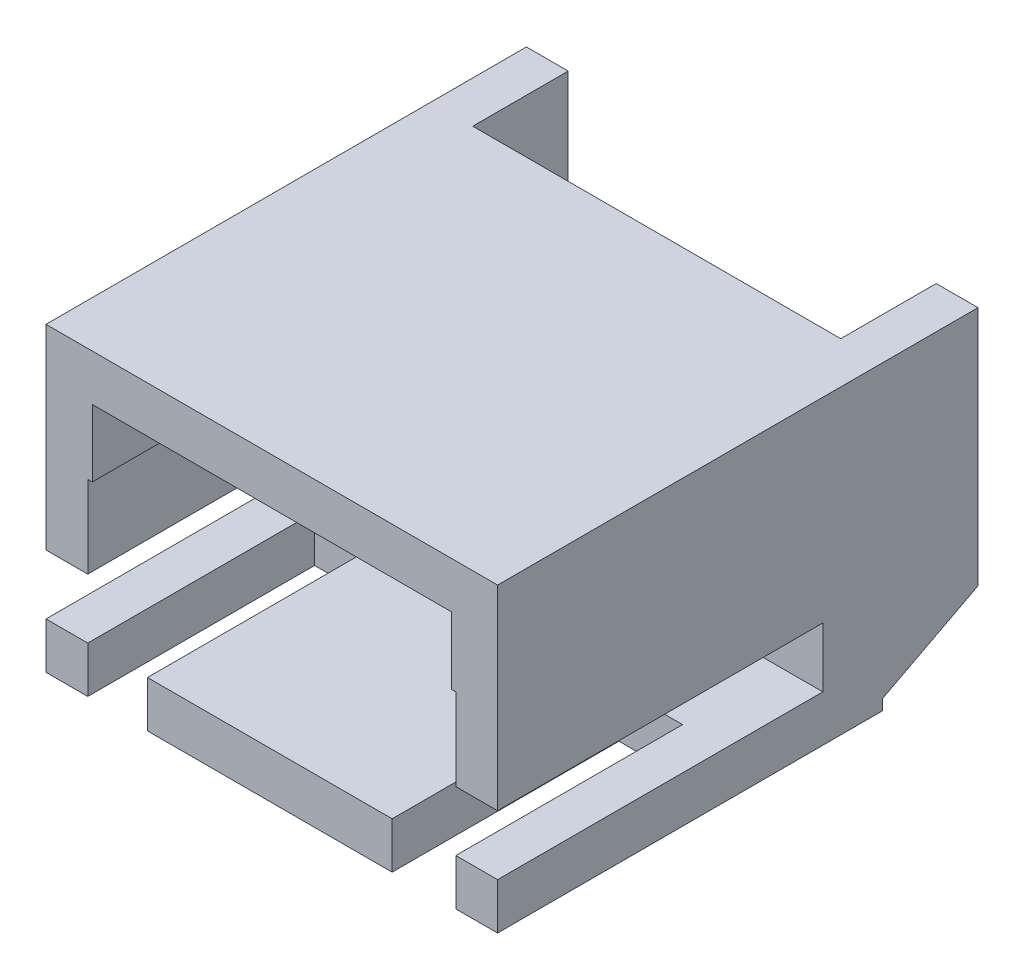
ISO-10303-21;
HEADER;
FILE_DESCRIPTION(('STEP AP214'),'2;1');
FILE_NAME('part.step','',(''),(''),'','','');
FILE_SCHEMA(('AUTOMOTIVE_DESIGN { 1 0 10303 214 1 1 1 1 }'));
ENDSEC;
DATA;
#1=APPLICATION_CONTEXT('core data for automotive mechanical design processes');
#2=APPLICATION_PROTOCOL_DEFINITION('international standard','automotive_design',2000,#1);
#3=PRODUCT_CONTEXT('',#1,'mechanical');
#4=PRODUCT('Part','Part','',(#3));
#5=PRODUCT_RELATED_PRODUCT_CATEGORY('part','',(#4));
#6=PRODUCT_DEFINITION_FORMATION('','',#4);
#7=PRODUCT_DEFINITION_CONTEXT('part definition',#1,'design');
#8=PRODUCT_DEFINITION('design','',#6,#7);
#9=PRODUCT_DEFINITION_SHAPE('','',#8);
#10=(LENGTH_UNIT() NAMED_UNIT(*) SI_UNIT(.MILLI.,.METRE.));
#11=(NAMED_UNIT(*) PLANE_ANGLE_UNIT() SI_UNIT($,.RADIAN.));
#12=(NAMED_UNIT(*) SI_UNIT($,.STERADIAN.) SOLID_ANGLE_UNIT());
#13=UNCERTAINTY_MEASURE_WITH_UNIT(LENGTH_MEASURE(1.E-05),#10,'distance_accuracy_value','');
#14=(GEOMETRIC_REPRESENTATION_CONTEXT(3) GLOBAL_UNCERTAINTY_ASSIGNED_CONTEXT((#13)) GLOBAL_UNIT_ASSIGNED_CONTEXT((#10,
#11,#12)) REPRESENTATION_CONTEXT('',''));
#15=CARTESIAN_POINT('',(0.,0.,0.));
#16=DIRECTION('',(0.,0.,1.));
#17=DIRECTION('',(1.,0.,0.));
#18=AXIS2_PLACEMENT_3D('',#15,#16,#17);
#19=CARTESIAN_POINT('',(37.0934233572,51.94081419327,-1.05));
#20=DIRECTION('',(0.,0.,-1.));
#21=DIRECTION('',(0.,-1.,0.));
#22=AXIS2_PLACEMENT_3D('',#19,#20,#21);
#23=PLANE('',#22);
#24=DIRECTION('',(1.,0.,0.));
#25=VECTOR('',#24,1.);
#26=CARTESIAN_POINT('',(29.127289,54.9,-1.05));
#27=LINE('',#26,#25);
#28=CARTESIAN_POINT('',(29.127289,54.9,-1.04999999999989));
#29=VERTEX_POINT('',#28);
#30=CARTESIAN_POINT('',(29.827289,54.9,-1.05));
#31=VERTEX_POINT('',#30);
#32=EDGE_CURVE('E492',#29,#31,#27,.T.);
#33=ORIENTED_EDGE('',*,*,#32,.T.);
#34=DIRECTION('',(0.,-1.,0.));
#35=VECTOR('',#34,1.);
#36=CARTESIAN_POINT('',(29.827289,54.9,-1.05000000000023));
#37=LINE('',#36,#35);
#38=CARTESIAN_POINT('',(29.827289,50.8633333333333,-1.05));
#39=VERTEX_POINT('',#38);
#40=EDGE_CURVE('E480',#31,#39,#37,.T.);
#41=ORIENTED_EDGE('',*,*,#40,.T.);
#42=DIRECTION('',(1.,0.,0.));
#43=VECTOR('',#42,1.);
#44=CARTESIAN_POINT('',(29.127289,50.8633333333291,-1.05));
#45=LINE('',#44,#43);
#46=CARTESIAN_POINT('',(29.127289,50.8633333333312,-1.05));
#47=VERTEX_POINT('',#46);
#48=EDGE_CURVE('E466',#47,#39,#45,.T.);
#49=ORIENTED_EDGE('',*,*,#48,.F.);
#50=DIRECTION('',(0.,1.,0.));
#51=VECTOR('',#50,1.);
#52=CARTESIAN_POINT('',(29.127289,50.8633333333334,-1.04999999999977));
#53=LINE('',#52,#51);
#54=EDGE_CURVE('E384',#47,#29,#53,.T.);
#55=ORIENTED_EDGE('',*,*,#54,.T.);
#56=EDGE_LOOP('',(#33,#41,#49,#55));
#57=FACE_BOUND('',#56,.T.);
#58=ADVANCED_FACE('F17',(#57),#23,.T.);
#59=CARTESIAN_POINT('',(31.49722712685,53.,4.901261798567));
#60=DIRECTION('',(0.,-1.,0.));
#61=DIRECTION('',(0.,0.,-1.));
#62=AXIS2_PLACEMENT_3D('',#59,#60,#61);
#63=PLANE('',#62);
#64=DIRECTION('',(-1.,0.,0.));
#65=VECTOR('',#64,1.);
#66=CARTESIAN_POINT('',(35.993819,53.,7.));
#67=LINE('',#66,#65);
#68=CARTESIAN_POINT('',(35.993819,53.,7.));
#69=VERTEX_POINT('',#68);
#70=CARTESIAN_POINT('',(35.918819,53.,7.));
#71=VERTEX_POINT('',#70);
#72=EDGE_CURVE('E313',#69,#71,#67,.T.);
#73=ORIENTED_EDGE('',*,*,#72,.T.);
#74=DIRECTION('',(0.,0.,-1.));
#75=VECTOR('',#74,1.);
#76=CARTESIAN_POINT('',(35.918819,53.,7.));
#77=LINE('',#76,#75);
#78=CARTESIAN_POINT('',(35.918819,53.,3.2));
#79=VERTEX_POINT('',#78);
#80=EDGE_CURVE('E564',#71,#79,#77,.T.);
#81=ORIENTED_EDGE('',*,*,#80,.T.);
#82=DIRECTION('',(1.,0.,0.));
#83=VECTOR('',#82,1.);
#84=CARTESIAN_POINT('',(35.918819,53.,3.2));
#85=LINE('',#84,#83);
#86=CARTESIAN_POINT('',(35.993819,53.,3.2));
#87=VERTEX_POINT('',#86);
#88=EDGE_CURVE('E555',#79,#87,#85,.T.);
#89=ORIENTED_EDGE('',*,*,#88,.T.);
#90=DIRECTION('',(0.,0.,1.));
#91=VECTOR('',#90,1.);
#92=CARTESIAN_POINT('',(35.993819,53.,3.2));
#93=LINE('',#92,#91);
#94=EDGE_CURVE('E549',#87,#69,#93,.T.);
#95=ORIENTED_EDGE('',*,*,#94,.T.);
#96=EDGE_LOOP('',(#73,#81,#89,#95));
#97=FACE_BOUND('',#96,.T.);
#98=ADVANCED_FACE('F935',(#97),#63,.T.);
#99=CARTESIAN_POINT('',(-5.,-0.1500000000001,7.));
#100=DIRECTION('',(0.,0.,1.));
#101=DIRECTION('',(1.,0.,0.));
#102=AXIS2_PLACEMENT_3D('',#99,#100,#101);
#103=PLANE('',#102);
#104=DIRECTION('',(0.,-1.,0.));
#105=VECTOR('',#104,1.);
#106=CARTESIAN_POINT('',(29.827289,50.625,7.));
#107=LINE('',#106,#105);
#108=CARTESIAN_POINT('',(29.827289,50.625,7.));
#109=VERTEX_POINT('',#108);
#110=CARTESIAN_POINT('',(29.827289,49.85,7.));
#111=VERTEX_POINT('',#110);
#112=EDGE_CURVE('E11',#109,#111,#107,.T.);
#113=ORIENTED_EDGE('',*,*,#112,.F.);
#114=DIRECTION('',(-1.,0.,0.));
#115=VECTOR('',#114,1.);
#116=CARTESIAN_POINT('',(29.827289,50.625,7.));
#117=LINE('',#116,#115);
#118=CARTESIAN_POINT('',(29.127289,50.625,7.));
#119=VERTEX_POINT('',#118);
#120=EDGE_CURVE('E483',#109,#119,#117,.T.);
#121=ORIENTED_EDGE('',*,*,#120,.T.);
#122=DIRECTION('',(0.,-1.,0.));
#123=VECTOR('',#122,1.);
#124=CARTESIAN_POINT('',(29.127289,50.625,7.));
#125=LINE('',#124,#123);
#126=CARTESIAN_POINT('',(29.127289,49.85,7.));
#127=VERTEX_POINT('',#126);
#128=EDGE_CURVE('E416',#119,#127,#125,.T.);
#129=ORIENTED_EDGE('',*,*,#128,.T.);
#130=DIRECTION('',(-1.,0.,0.));
#131=VECTOR('',#130,1.);
#132=CARTESIAN_POINT('',(29.827289,49.85,7.));
#133=LINE('',#132,#131);
#134=EDGE_CURVE('E426',#111,#127,#133,.T.);
#135=ORIENTED_EDGE('',*,*,#134,.F.);
#136=EDGE_LOOP('',(#113,#121,#129,#135));
#137=FACE_BOUND('',#136,.T.);
#138=ADVANCED_FACE('F940',(#137),#103,.T.);
#139=CARTESIAN_POINT('',(29.827289,49.85,7.));
#140=DIRECTION('',(-1.,0.,0.));
#141=DIRECTION('',(0.,0.,1.));
#142=AXIS2_PLACEMENT_3D('',#139,#140,#141);
#143=PLANE('',#142);
#144=DIRECTION('',(0.,0.,-1.));
#145=VECTOR('',#144,1.);
#146=CARTESIAN_POINT('',(29.827289,50.625,7.));
#147=LINE('',#146,#145);
#148=CARTESIAN_POINT('',(29.827289,50.625,3.2));
#149=VERTEX_POINT('',#148);
#150=EDGE_CURVE('E303',#109,#149,#147,.T.);
#151=ORIENTED_EDGE('',*,*,#150,.F.);
#152=ORIENTED_EDGE('',*,*,#112,.T.);
#153=DIRECTION('',(0.,0.,-1.));
#154=VECTOR('',#153,1.);
#155=CARTESIAN_POINT('',(29.827289,49.85,7.));
#156=LINE('',#155,#154);
#157=CARTESIAN_POINT('',(29.827289,49.85,3.2));
#158=VERTEX_POINT('',#157);
#159=EDGE_CURVE('E422',#111,#158,#156,.T.);
#160=ORIENTED_EDGE('',*,*,#159,.T.);
#161=DIRECTION('',(0.,1.,0.));
#162=VECTOR('',#161,1.);
#163=CARTESIAN_POINT('',(29.827289,49.85,3.2));
#164=LINE('',#163,#162);
#165=EDGE_CURVE('E26',#158,#149,#164,.T.);
#166=ORIENTED_EDGE('',*,*,#165,.T.);
#167=EDGE_LOOP('',(#151,#152,#160,#166));
#168=FACE_BOUND('',#167,.T.);
#169=ADVANCED_FACE('F1023',(#168),#143,.F.);
#170=CARTESIAN_POINT('',(29.827289,49.85,3.2));
#171=DIRECTION('',(0.,0.,-1.));
#172=DIRECTION('',(0.,-1.,0.));
#173=AXIS2_PLACEMENT_3D('',#170,#171,#172);
#174=PLANE('',#173);
#175=DIRECTION('',(1.,0.,0.));
#176=VECTOR('',#175,1.);
#177=CARTESIAN_POINT('',(29.827289,50.625,3.2));
#178=LINE('',#177,#176);
#179=CARTESIAN_POINT('',(30.827289,50.625,3.2));
#180=VERTEX_POINT('',#179);
#181=EDGE_CURVE('E296',#149,#180,#178,.T.);
#182=ORIENTED_EDGE('',*,*,#181,.F.);
#183=ORIENTED_EDGE('',*,*,#165,.F.);
#184=DIRECTION('',(1.,0.,0.));
#185=VECTOR('',#184,1.);
#186=CARTESIAN_POINT('',(29.827289,49.85,3.2));
#187=LINE('',#186,#185);
#188=CARTESIAN_POINT('',(30.827289,49.85,3.2));
#189=VERTEX_POINT('',#188);
#190=EDGE_CURVE('E421',#158,#189,#187,.T.);
#191=ORIENTED_EDGE('',*,*,#190,.T.);
#192=DIRECTION('',(0.,1.,0.));
#193=VECTOR('',#192,1.);
#194=CARTESIAN_POINT('',(30.827289,49.85,3.2));
#195=LINE('',#194,#193);
#196=EDGE_CURVE('E20',#189,#180,#195,.T.);
#197=ORIENTED_EDGE('',*,*,#196,.T.);
#198=EDGE_LOOP('',(#182,#183,#191,#197));
#199=FACE_BOUND('',#198,.T.);
#200=ADVANCED_FACE('F1097',(#199),#174,.F.);
#201=CARTESIAN_POINT('',(30.827289,49.85,3.2));
#202=DIRECTION('',(1.,0.,0.));
#203=DIRECTION('',(0.,1.,0.));
#204=AXIS2_PLACEMENT_3D('',#201,#202,#203);
#205=PLANE('',#204);
#206=DIRECTION('',(0.,0.,-1.));
#207=VECTOR('',#206,1.);
#208=CARTESIAN_POINT('',(30.827289,50.625,7.));
#209=LINE('',#208,#207);
#210=CARTESIAN_POINT('',(30.827289,50.625,7.));
#211=VERTEX_POINT('',#210);
#212=EDGE_CURVE('E274',#211,#180,#209,.T.);
#213=ORIENTED_EDGE('',*,*,#212,.T.);
#214=ORIENTED_EDGE('',*,*,#196,.F.);
#215=DIRECTION('',(0.,0.,-1.));
#216=VECTOR('',#215,1.);
#217=CARTESIAN_POINT('',(30.827289,49.85,7.));
#218=LINE('',#217,#216);
#219=CARTESIAN_POINT('',(30.827289,49.85,7.));
#220=VERTEX_POINT('',#219);
#221=EDGE_CURVE('E277',#220,#189,#218,.T.);
#222=ORIENTED_EDGE('',*,*,#221,.F.);
#223=DIRECTION('',(0.,-1.,0.));
#224=VECTOR('',#223,1.);
#225=CARTESIAN_POINT('',(30.827289,50.625,7.));
#226=LINE('',#225,#224);
#227=EDGE_CURVE('E270',#211,#220,#226,.T.);
#228=ORIENTED_EDGE('',*,*,#227,.F.);
#229=EDGE_LOOP('',(#213,#214,#222,#228));
#230=FACE_BOUND('',#229,.T.);
#231=ADVANCED_FACE('F272',(#230),#205,.F.);
#232=CARTESIAN_POINT('',(0.,-0.1500000000001,7.));
#233=DIRECTION('',(0.,0.,1.));
#234=DIRECTION('',(1.,0.,0.));
#235=AXIS2_PLACEMENT_3D('',#232,#233,#234);
#236=PLANE('',#235);
#237=ORIENTED_EDGE('',*,*,#227,.T.);
#238=DIRECTION('',(1.,0.,0.));
#239=VECTOR('',#238,1.);
#240=CARTESIAN_POINT('',(30.827289,49.85,7.));
#241=LINE('',#240,#239);
#242=CARTESIAN_POINT('',(34.927289,49.85,7.));
#243=VERTEX_POINT('',#242);
#244=EDGE_CURVE('E412',#220,#243,#241,.T.);
#245=ORIENTED_EDGE('',*,*,#244,.T.);
#246=DIRECTION('',(0.,1.,0.));
#247=VECTOR('',#246,1.);
#248=CARTESIAN_POINT('',(34.927289,49.85,7.));
#249=LINE('',#248,#247);
#250=CARTESIAN_POINT('',(34.927289,50.625,7.));
#251=VERTEX_POINT('',#250);
#252=EDGE_CURVE('E282',#243,#251,#249,.T.);
#253=ORIENTED_EDGE('',*,*,#252,.T.);
#254=DIRECTION('',(1.,0.,0.));
#255=VECTOR('',#254,1.);
#256=CARTESIAN_POINT('',(30.827289,50.625,7.));
#257=LINE('',#256,#255);
#258=EDGE_CURVE('E285',#211,#251,#257,.T.);
#259=ORIENTED_EDGE('',*,*,#258,.F.);
#260=EDGE_LOOP('',(#237,#245,#253,#259));
#261=FACE_BOUND('',#260,.T.);
#262=ADVANCED_FACE('F286',(#261),#236,.T.);
#263=CARTESIAN_POINT('',(34.927289,49.85,7.));
#264=DIRECTION('',(-1.,0.,0.));
#265=DIRECTION('',(0.,0.,1.));
#266=AXIS2_PLACEMENT_3D('',#263,#264,#265);
#267=PLANE('',#266);
#268=DIRECTION('',(0.,0.,1.));
#269=VECTOR('',#268,1.);
#270=CARTESIAN_POINT('',(34.927289,50.625,3.2));
#271=LINE('',#270,#269);
#272=CARTESIAN_POINT('',(34.927289,50.625,3.2));
#273=VERTEX_POINT('',#272);
#274=EDGE_CURVE('E291',#273,#251,#271,.T.);
#275=ORIENTED_EDGE('',*,*,#274,.T.);
#276=ORIENTED_EDGE('',*,*,#252,.F.);
#277=DIRECTION('',(0.,0.,1.));
#278=VECTOR('',#277,1.);
#279=CARTESIAN_POINT('',(34.927289,49.85,3.2));
#280=LINE('',#279,#278);
#281=CARTESIAN_POINT('',(34.927289,49.85,3.2));
#282=VERTEX_POINT('',#281);
#283=EDGE_CURVE('E332',#282,#243,#280,.T.);
#284=ORIENTED_EDGE('',*,*,#283,.F.);
#285=DIRECTION('',(0.,-1.,0.));
#286=VECTOR('',#285,1.);
#287=CARTESIAN_POINT('',(34.927289,50.625,3.2));
#288=LINE('',#287,#286);
#289=EDGE_CURVE('E436',#273,#282,#288,.T.);
#290=ORIENTED_EDGE('',*,*,#289,.F.);
#291=EDGE_LOOP('',(#275,#276,#284,#290));
#292=FACE_BOUND('',#291,.T.);
#293=ADVANCED_FACE('F1074',(#292),#267,.F.);
#294=CARTESIAN_POINT('',(32.927289,49.85,3.2));
#295=DIRECTION('',(0.,0.,-1.));
#296=DIRECTION('',(0.,-1.,0.));
#297=AXIS2_PLACEMENT_3D('',#294,#295,#296);
#298=PLANE('',#297);
#299=DIRECTION('',(1.,0.,0.));
#300=VECTOR('',#299,1.);
#301=CARTESIAN_POINT('',(34.927289,50.625,3.2));
#302=LINE('',#301,#300);
#303=CARTESIAN_POINT('',(35.993819,50.625,3.2));
#304=VERTEX_POINT('',#303);
#305=EDGE_CURVE('E449',#273,#304,#302,.T.);
#306=ORIENTED_EDGE('',*,*,#305,.F.);
#307=ORIENTED_EDGE('',*,*,#289,.T.);
#308=DIRECTION('',(1.,0.,0.));
#309=VECTOR('',#308,1.);
#310=CARTESIAN_POINT('',(34.927289,49.85,3.2));
#311=LINE('',#310,#309);
#312=CARTESIAN_POINT('',(35.993819,49.85,3.2));
#313=VERTEX_POINT('',#312);
#314=EDGE_CURVE('E329',#282,#313,#311,.T.);
#315=ORIENTED_EDGE('',*,*,#314,.T.);
#316=DIRECTION('',(0.,1.,0.));
#317=VECTOR('',#316,1.);
#318=CARTESIAN_POINT('',(35.993819,49.85,3.2));
#319=LINE('',#318,#317);
#320=EDGE_CURVE('E52',#313,#304,#319,.T.);
#321=ORIENTED_EDGE('',*,*,#320,.T.);
#322=EDGE_LOOP('',(#306,#307,#315,#321));
#323=FACE_BOUND('',#322,.T.);
#324=ADVANCED_FACE('F1066',(#323),#298,.F.);
#325=CARTESIAN_POINT('',(35.993819,49.85,3.2));
#326=DIRECTION('',(1.,0.,0.));
#327=DIRECTION('',(0.,1.,0.));
#328=AXIS2_PLACEMENT_3D('',#325,#326,#327);
#329=PLANE('',#328);
#330=DIRECTION('',(0.,0.,1.));
#331=VECTOR('',#330,1.);
#332=CARTESIAN_POINT('',(35.993819,50.625,3.2));
#333=LINE('',#332,#331);
#334=CARTESIAN_POINT('',(35.993819,50.625,7.));
#335=VERTEX_POINT('',#334);
#336=EDGE_CURVE('E446',#304,#335,#333,.T.);
#337=ORIENTED_EDGE('',*,*,#336,.F.);
#338=ORIENTED_EDGE('',*,*,#320,.F.);
#339=DIRECTION('',(0.,0.,1.));
#340=VECTOR('',#339,1.);
#341=CARTESIAN_POINT('',(35.993819,49.85,3.2));
#342=LINE('',#341,#340);
#343=CARTESIAN_POINT('',(35.993819,49.85,7.));
#344=VERTEX_POINT('',#343);
#345=EDGE_CURVE('E333',#313,#344,#342,.T.);
#346=ORIENTED_EDGE('',*,*,#345,.T.);
#347=DIRECTION('',(0.,1.,0.));
#348=VECTOR('',#347,1.);
#349=CARTESIAN_POINT('',(35.993819,49.85,7.));
#350=LINE('',#349,#348);
#351=EDGE_CURVE('E39',#344,#335,#350,.T.);
#352=ORIENTED_EDGE('',*,*,#351,.T.);
#353=EDGE_LOOP('',(#337,#338,#346,#352));
#354=FACE_BOUND('',#353,.T.);
#355=ADVANCED_FACE('F1057',(#354),#329,.F.);
#356=CARTESIAN_POINT('',(-7.43347,-0.1500000000001,7.));
#357=DIRECTION('',(0.,0.,1.));
#358=DIRECTION('',(1.,0.,0.));
#359=AXIS2_PLACEMENT_3D('',#356,#357,#358);
#360=PLANE('',#359);
#361=DIRECTION('',(1.,0.,0.));
#362=VECTOR('',#361,1.);
#363=CARTESIAN_POINT('',(35.993819,50.625,7.));
#364=LINE('',#363,#362);
#365=CARTESIAN_POINT('',(36.693819,50.625,7.));
#366=VERTEX_POINT('',#365);
#367=EDGE_CURVE('E442',#335,#366,#364,.T.);
#368=ORIENTED_EDGE('',*,*,#367,.F.);
#369=ORIENTED_EDGE('',*,*,#351,.F.);
#370=DIRECTION('',(1.,0.,0.));
#371=VECTOR('',#370,1.);
#372=CARTESIAN_POINT('',(35.993819,49.85,7.));
#373=LINE('',#372,#371);
#374=CARTESIAN_POINT('',(36.693819,49.85,7.));
#375=VERTEX_POINT('',#374);
#376=EDGE_CURVE('E393',#344,#375,#373,.T.);
#377=ORIENTED_EDGE('',*,*,#376,.T.);
#378=DIRECTION('',(0.,-1.,0.));
#379=VECTOR('',#378,1.);
#380=CARTESIAN_POINT('',(36.693819,50.625,7.));
#381=LINE('',#380,#379);
#382=EDGE_CURVE('E343',#366,#375,#381,.T.);
#383=ORIENTED_EDGE('',*,*,#382,.F.);
#384=EDGE_LOOP('',(#368,#369,#377,#383));
#385=FACE_BOUND('',#384,.T.);
#386=ADVANCED_FACE('F1049',(#385),#360,.T.);
#387=CARTESIAN_POINT('',(34.127289,50.625,7.));
#388=DIRECTION('',(0.,-1.,0.));
#389=DIRECTION('',(0.,0.,-1.));
#390=AXIS2_PLACEMENT_3D('',#387,#388,#389);
#391=PLANE('',#390);
#392=DIRECTION('',(1.,0.,0.));
#393=VECTOR('',#392,1.);
#394=CARTESIAN_POINT('',(29.127289,50.625,1.55));
#395=LINE('',#394,#393);
#396=CARTESIAN_POINT('',(29.127289,50.625,1.55));
#397=VERTEX_POINT('',#396);
#398=CARTESIAN_POINT('',(36.693819,50.625,1.55));
#399=VERTEX_POINT('',#398);
#400=EDGE_CURVE('E348',#397,#399,#395,.T.);
#401=ORIENTED_EDGE('',*,*,#400,.F.);
#402=DIRECTION('',(0.,0.,-1.));
#403=VECTOR('',#402,1.);
#404=CARTESIAN_POINT('',(29.127289,50.625,7.));
#405=LINE('',#404,#403);
#406=EDGE_CURVE('E360',#119,#397,#405,.T.);
#407=ORIENTED_EDGE('',*,*,#406,.F.);
#408=ORIENTED_EDGE('',*,*,#120,.F.);
#409=ORIENTED_EDGE('',*,*,#150,.T.);
#410=ORIENTED_EDGE('',*,*,#181,.T.);
#411=ORIENTED_EDGE('',*,*,#212,.F.);
#412=ORIENTED_EDGE('',*,*,#258,.T.);
#413=ORIENTED_EDGE('',*,*,#274,.F.);
#414=ORIENTED_EDGE('',*,*,#305,.T.);
#415=ORIENTED_EDGE('',*,*,#336,.T.);
#416=ORIENTED_EDGE('',*,*,#367,.T.);
#417=DIRECTION('',(0.,0.,-1.));
#418=VECTOR('',#417,1.);
#419=CARTESIAN_POINT('',(36.693819,50.625,7.));
#420=LINE('',#419,#418);
#421=EDGE_CURVE('E339',#366,#399,#420,.T.);
#422=ORIENTED_EDGE('',*,*,#421,.T.);
#423=EDGE_LOOP('',(#401,#407,#408,#409,#410,#411,#412,#413,#414,#415,#416,#422));
#424=FACE_BOUND('',#423,.T.);
#425=ADVANCED_FACE('F293',(#424),#391,.F.);
#426=CARTESIAN_POINT('',(43.72562618935,51.88145198998,1.55));
#427=DIRECTION('',(0.,0.,1.));
#428=DIRECTION('',(1.,0.,0.));
#429=AXIS2_PLACEMENT_3D('',#426,#427,#428);
#430=PLANE('',#429);
#431=ORIENTED_EDGE('',*,*,#400,.T.);
#432=DIRECTION('',(0.,-1.,0.));
#433=VECTOR('',#432,1.);
#434=CARTESIAN_POINT('',(36.693819,51.625,1.55));
#435=LINE('',#434,#433);
#436=CARTESIAN_POINT('',(36.693819,51.625,1.55));
#437=VERTEX_POINT('',#436);
#438=EDGE_CURVE('E344',#437,#399,#435,.T.);
#439=ORIENTED_EDGE('',*,*,#438,.F.);
#440=DIRECTION('',(-1.,0.,0.));
#441=VECTOR('',#440,1.);
#442=CARTESIAN_POINT('',(36.693819,51.625,1.55));
#443=LINE('',#442,#441);
#444=CARTESIAN_POINT('',(35.918819,51.625,1.55));
#445=VERTEX_POINT('',#444);
#446=EDGE_CURVE('E525',#437,#445,#443,.T.);
#447=ORIENTED_EDGE('',*,*,#446,.T.);
#448=DIRECTION('',(0.,-1.,0.));
#449=VECTOR('',#448,1.);
#450=CARTESIAN_POINT('',(35.918819,54.125,1.55));
#451=LINE('',#450,#449);
#452=CARTESIAN_POINT('',(35.918819,54.125,1.55));
#453=VERTEX_POINT('',#452);
#454=EDGE_CURVE('E397',#453,#445,#451,.T.);
#455=ORIENTED_EDGE('',*,*,#454,.F.);
#456=DIRECTION('',(1.,0.,0.));
#457=VECTOR('',#456,1.);
#458=CARTESIAN_POINT('',(29.902289,54.125,1.55));
#459=LINE('',#458,#457);
#460=CARTESIAN_POINT('',(29.902289,54.125,1.55));
#461=VERTEX_POINT('',#460);
#462=EDGE_CURVE('E484',#461,#453,#459,.T.);
#463=ORIENTED_EDGE('',*,*,#462,.F.);
#464=DIRECTION('',(0.,-1.,0.));
#465=VECTOR('',#464,1.);
#466=CARTESIAN_POINT('',(29.902289,54.125,1.55));
#467=LINE('',#466,#465);
#468=CARTESIAN_POINT('',(29.902289,51.625,1.55));
#469=VERTEX_POINT('',#468);
#470=EDGE_CURVE('E572',#461,#469,#467,.T.);
#471=ORIENTED_EDGE('',*,*,#470,.T.);
#472=DIRECTION('',(-1.,0.,0.));
#473=VECTOR('',#472,1.);
#474=CARTESIAN_POINT('',(29.902289,51.625,1.55));
#475=LINE('',#474,#473);
#476=CARTESIAN_POINT('',(29.127289,51.625,1.55));
#477=VERTEX_POINT('',#476);
#478=EDGE_CURVE('E584',#469,#477,#475,.T.);
#479=ORIENTED_EDGE('',*,*,#478,.T.);
#480=DIRECTION('',(0.,-1.,0.));
#481=VECTOR('',#480,1.);
#482=CARTESIAN_POINT('',(29.127289,51.625,1.55));
#483=LINE('',#482,#481);
#484=EDGE_CURVE('E355',#477,#397,#483,.T.);
#485=ORIENTED_EDGE('',*,*,#484,.T.);
#486=EDGE_LOOP('',(#431,#439,#447,#455,#463,#471,#479,#485));
#487=FACE_BOUND('',#486,.T.);
#488=ADVANCED_FACE('F1032',(#487),#430,.T.);
#489=CARTESIAN_POINT('',(33.93069712685,53.,4.901261798567));
#490=DIRECTION('',(0.,-1.,0.));
#491=DIRECTION('',(0.,0.,-1.));
#492=AXIS2_PLACEMENT_3D('',#489,#490,#491);
#493=PLANE('',#492);
#494=DIRECTION('',(0.,0.,1.));
#495=VECTOR('',#494,1.);
#496=CARTESIAN_POINT('',(29.902289,53.,3.2));
#497=LINE('',#496,#495);
#498=CARTESIAN_POINT('',(29.902289,53.,3.2));
#499=VERTEX_POINT('',#498);
#500=CARTESIAN_POINT('',(29.902289,53.,7.));
#501=VERTEX_POINT('',#500);
#502=EDGE_CURVE('E579',#499,#501,#497,.T.);
#503=ORIENTED_EDGE('',*,*,#502,.T.);
#504=DIRECTION('',(1.,0.,0.));
#505=VECTOR('',#504,1.);
#506=CARTESIAN_POINT('',(29.827289,53.,7.));
#507=LINE('',#506,#505);
#508=CARTESIAN_POINT('',(29.827289,53.,7.));
#509=VERTEX_POINT('',#508);
#510=EDGE_CURVE('E454',#509,#501,#507,.T.);
#511=ORIENTED_EDGE('',*,*,#510,.F.);
#512=DIRECTION('',(0.,0.,1.));
#513=VECTOR('',#512,1.);
#514=CARTESIAN_POINT('',(29.827289,53.,3.2));
#515=LINE('',#514,#513);
#516=CARTESIAN_POINT('',(29.827289,53.,3.2));
#517=VERTEX_POINT('',#516);
#518=EDGE_CURVE('E349',#517,#509,#515,.T.);
#519=ORIENTED_EDGE('',*,*,#518,.F.);
#520=DIRECTION('',(-1.,0.,0.));
#521=VECTOR('',#520,1.);
#522=CARTESIAN_POINT('',(29.902289,53.,3.2));
#523=LINE('',#522,#521);
#524=EDGE_CURVE('E345',#499,#517,#523,.T.);
#525=ORIENTED_EDGE('',*,*,#524,.F.);
#526=EDGE_LOOP('',(#503,#511,#519,#525));
#527=FACE_BOUND('',#526,.T.);
#528=ADVANCED_FACE('F1014',(#527),#493,.T.);
#529=CARTESIAN_POINT('',(29.827289,50.,3.2));
#530=DIRECTION('',(0.,0.,-1.));
#531=DIRECTION('',(0.,-1.,0.));
#532=AXIS2_PLACEMENT_3D('',#529,#530,#531);
#533=PLANE('',#532);
#534=DIRECTION('',(-1.,0.,0.));
#535=VECTOR('',#534,1.);
#536=CARTESIAN_POINT('',(29.902289,51.625,3.2));
#537=LINE('',#536,#535);
#538=CARTESIAN_POINT('',(29.902289,51.625,3.2));
#539=VERTEX_POINT('',#538);
#540=CARTESIAN_POINT('',(29.827289,51.625,3.2));
#541=VERTEX_POINT('',#540);
#542=EDGE_CURVE('E580',#539,#541,#537,.T.);
#543=ORIENTED_EDGE('',*,*,#542,.F.);
#544=DIRECTION('',(0.,1.,0.));
#545=VECTOR('',#544,1.);
#546=CARTESIAN_POINT('',(29.902289,51.625,3.2));
#547=LINE('',#546,#545);
#548=EDGE_CURVE('E587',#539,#499,#547,.T.);
#549=ORIENTED_EDGE('',*,*,#548,.T.);
#550=ORIENTED_EDGE('',*,*,#524,.T.);
#551=DIRECTION('',(0.,-1.,0.));
#552=VECTOR('',#551,1.);
#553=CARTESIAN_POINT('',(29.827289,53.,3.2));
#554=LINE('',#553,#552);
#555=EDGE_CURVE('E539',#517,#541,#554,.T.);
#556=ORIENTED_EDGE('',*,*,#555,.T.);
#557=EDGE_LOOP('',(#543,#549,#550,#556));
#558=FACE_BOUND('',#557,.T.);
#559=ADVANCED_FACE('F1005',(#558),#533,.F.);
#560=CARTESIAN_POINT('',(29.827289,50.,7.));
#561=DIRECTION('',(-1.,0.,0.));
#562=DIRECTION('',(0.,0.,1.));
#563=AXIS2_PLACEMENT_3D('',#560,#561,#562);
#564=PLANE('',#563);
#565=ORIENTED_EDGE('',*,*,#555,.F.);
#566=ORIENTED_EDGE('',*,*,#518,.T.);
#567=DIRECTION('',(0.,-1.,0.));
#568=VECTOR('',#567,1.);
#569=CARTESIAN_POINT('',(29.827289,53.,7.));
#570=LINE('',#569,#568);
#571=CARTESIAN_POINT('',(29.827289,51.625,7.));
#572=VERTEX_POINT('',#571);
#573=EDGE_CURVE('E450',#509,#572,#570,.T.);
#574=ORIENTED_EDGE('',*,*,#573,.T.);
#575=DIRECTION('',(0.,0.,1.));
#576=VECTOR('',#575,1.);
#577=CARTESIAN_POINT('',(29.827289,51.625,3.2));
#578=LINE('',#577,#576);
#579=EDGE_CURVE('E542',#541,#572,#578,.T.);
#580=ORIENTED_EDGE('',*,*,#579,.F.);
#581=EDGE_LOOP('',(#565,#566,#574,#580));
#582=FACE_BOUND('',#581,.T.);
#583=ADVANCED_FACE('F996',(#582),#564,.F.);
#584=CARTESIAN_POINT('',(39.127289,51.625,7.));
#585=DIRECTION('',(0.,1.,0.));
#586=DIRECTION('',(1.,0.,0.));
#587=AXIS2_PLACEMENT_3D('',#584,#585,#586);
#588=PLANE('',#587);
#589=DIRECTION('',(0.,0.,1.));
#590=VECTOR('',#589,1.);
#591=CARTESIAN_POINT('',(29.127289,51.625,1.55));
#592=LINE('',#591,#590);
#593=CARTESIAN_POINT('',(29.127289,51.625,7.));
#594=VERTEX_POINT('',#593);
#595=EDGE_CURVE('E359',#477,#594,#592,.T.);
#596=ORIENTED_EDGE('',*,*,#595,.F.);
#597=ORIENTED_EDGE('',*,*,#478,.F.);
#598=DIRECTION('',(0.,0.,1.));
#599=VECTOR('',#598,1.);
#600=CARTESIAN_POINT('',(29.902289,51.625,1.55));
#601=LINE('',#600,#599);
#602=EDGE_CURVE('E487',#469,#539,#601,.T.);
#603=ORIENTED_EDGE('',*,*,#602,.T.);
#604=ORIENTED_EDGE('',*,*,#542,.T.);
#605=ORIENTED_EDGE('',*,*,#579,.T.);
#606=DIRECTION('',(-1.,0.,0.));
#607=VECTOR('',#606,1.);
#608=CARTESIAN_POINT('',(29.827289,51.625,7.));
#609=LINE('',#608,#607);
#610=EDGE_CURVE('E455',#572,#594,#609,.T.);
#611=ORIENTED_EDGE('',*,*,#610,.T.);
#612=EDGE_LOOP('',(#596,#597,#603,#604,#605,#611));
#613=FACE_BOUND('',#612,.T.);
#614=ADVANCED_FACE('F973',(#613),#588,.F.);
#615=CARTESIAN_POINT('',(29.902289,54.975,7.));
#616=DIRECTION('',(-1.,0.,0.));
#617=DIRECTION('',(0.,0.,1.));
#618=AXIS2_PLACEMENT_3D('',#615,#616,#617);
#619=PLANE('',#618);
#620=ORIENTED_EDGE('',*,*,#602,.F.);
#621=ORIENTED_EDGE('',*,*,#470,.F.);
#622=DIRECTION('',(0.,0.,1.));
#623=VECTOR('',#622,1.);
#624=CARTESIAN_POINT('',(29.902289,54.125,1.55));
#625=LINE('',#624,#623);
#626=CARTESIAN_POINT('',(29.902289,54.125,7.));
#627=VERTEX_POINT('',#626);
#628=EDGE_CURVE('E488',#461,#627,#625,.T.);
#629=ORIENTED_EDGE('',*,*,#628,.T.);
#630=DIRECTION('',(0.,-1.,0.));
#631=VECTOR('',#630,1.);
#632=CARTESIAN_POINT('',(29.902289,54.125,7.));
#633=LINE('',#632,#631);
#634=EDGE_CURVE('E509',#627,#501,#633,.T.);
#635=ORIENTED_EDGE('',*,*,#634,.T.);
#636=ORIENTED_EDGE('',*,*,#502,.F.);
#637=ORIENTED_EDGE('',*,*,#548,.F.);
#638=EDGE_LOOP('',(#620,#621,#629,#635,#636,#637));
#639=FACE_BOUND('',#638,.T.);
#640=ADVANCED_FACE('F901',(#639),#619,.F.);
#641=CARTESIAN_POINT('',(43.352289,54.125,7.));
#642=DIRECTION('',(0.,1.,0.));
#643=DIRECTION('',(1.,0.,0.));
#644=AXIS2_PLACEMENT_3D('',#641,#642,#643);
#645=PLANE('',#644);
#646=ORIENTED_EDGE('',*,*,#628,.F.);
#647=ORIENTED_EDGE('',*,*,#462,.T.);
#648=DIRECTION('',(0.,0.,1.));
#649=VECTOR('',#648,1.);
#650=CARTESIAN_POINT('',(35.918819,54.125,1.55));
#651=LINE('',#650,#649);
#652=CARTESIAN_POINT('',(35.918819,54.125,7.));
#653=VERTEX_POINT('',#652);
#654=EDGE_CURVE('E394',#453,#653,#651,.T.);
#655=ORIENTED_EDGE('',*,*,#654,.T.);
#656=DIRECTION('',(1.,0.,0.));
#657=VECTOR('',#656,1.);
#658=CARTESIAN_POINT('',(29.902289,54.125,7.));
#659=LINE('',#658,#657);
#660=EDGE_CURVE('E314',#627,#653,#659,.T.);
#661=ORIENTED_EDGE('',*,*,#660,.F.);
#662=EDGE_LOOP('',(#646,#647,#655,#661));
#663=FACE_BOUND('',#662,.T.);
#664=ADVANCED_FACE('F895',(#663),#645,.F.);
#665=CARTESIAN_POINT('',(35.918819,50.775,7.));
#666=DIRECTION('',(1.,0.,0.));
#667=DIRECTION('',(0.,1.,0.));
#668=AXIS2_PLACEMENT_3D('',#665,#666,#667);
#669=PLANE('',#668);
#670=ORIENTED_EDGE('',*,*,#654,.F.);
#671=ORIENTED_EDGE('',*,*,#454,.T.);
#672=DIRECTION('',(0.,0.,1.));
#673=VECTOR('',#672,1.);
#674=CARTESIAN_POINT('',(35.918819,51.625,1.55));
#675=LINE('',#674,#673);
#676=CARTESIAN_POINT('',(35.918819,51.625,3.2));
#677=VERTEX_POINT('',#676);
#678=EDGE_CURVE('E521',#445,#677,#675,.T.);
#679=ORIENTED_EDGE('',*,*,#678,.T.);
#680=DIRECTION('',(0.,1.,0.));
#681=VECTOR('',#680,1.);
#682=CARTESIAN_POINT('',(35.918819,51.625,3.2));
#683=LINE('',#682,#681);
#684=EDGE_CURVE('E398',#677,#79,#683,.T.);
#685=ORIENTED_EDGE('',*,*,#684,.T.);
#686=ORIENTED_EDGE('',*,*,#80,.F.);
#687=DIRECTION('',(0.,-1.,0.));
#688=VECTOR('',#687,1.);
#689=CARTESIAN_POINT('',(35.918819,54.125,7.));
#690=LINE('',#689,#688);
#691=EDGE_CURVE('E309',#653,#71,#690,.T.);
#692=ORIENTED_EDGE('',*,*,#691,.F.);
#693=EDGE_LOOP('',(#670,#671,#679,#685,#686,#692));
#694=FACE_BOUND('',#693,.T.);
#695=ADVANCED_FACE('F900',(#694),#669,.F.);
#696=CARTESIAN_POINT('',(34.493819,50.,3.2));
#697=DIRECTION('',(0.,0.,-1.));
#698=DIRECTION('',(0.,-1.,0.));
#699=AXIS2_PLACEMENT_3D('',#696,#697,#698);
#700=PLANE('',#699);
#701=DIRECTION('',(0.,-1.,0.));
#702=VECTOR('',#701,1.);
#703=CARTESIAN_POINT('',(35.993819,53.,3.2));
#704=LINE('',#703,#702);
#705=CARTESIAN_POINT('',(35.993819,51.625,3.2));
#706=VERTEX_POINT('',#705);
#707=EDGE_CURVE('E552',#87,#706,#704,.T.);
#708=ORIENTED_EDGE('',*,*,#707,.F.);
#709=ORIENTED_EDGE('',*,*,#88,.F.);
#710=ORIENTED_EDGE('',*,*,#684,.F.);
#711=DIRECTION('',(1.,0.,0.));
#712=VECTOR('',#711,1.);
#713=CARTESIAN_POINT('',(35.918819,51.625,3.2));
#714=LINE('',#713,#712);
#715=EDGE_CURVE('E526',#677,#706,#714,.T.);
#716=ORIENTED_EDGE('',*,*,#715,.T.);
#717=EDGE_LOOP('',(#708,#709,#710,#716));
#718=FACE_BOUND('',#717,.T.);
#719=ADVANCED_FACE('F913',(#718),#700,.F.);
#720=CARTESIAN_POINT('',(35.993819,50.,3.2));
#721=DIRECTION('',(1.,0.,0.));
#722=DIRECTION('',(0.,1.,0.));
#723=AXIS2_PLACEMENT_3D('',#720,#721,#722);
#724=PLANE('',#723);
#725=DIRECTION('',(0.,-1.,0.));
#726=VECTOR('',#725,1.);
#727=CARTESIAN_POINT('',(35.993819,53.,7.));
#728=LINE('',#727,#726);
#729=CARTESIAN_POINT('',(35.993819,51.625,7.));
#730=VERTEX_POINT('',#729);
#731=EDGE_CURVE('E375',#69,#730,#728,.T.);
#732=ORIENTED_EDGE('',*,*,#731,.F.);
#733=ORIENTED_EDGE('',*,*,#94,.F.);
#734=ORIENTED_EDGE('',*,*,#707,.T.);
#735=DIRECTION('',(0.,0.,-1.));
#736=VECTOR('',#735,1.);
#737=CARTESIAN_POINT('',(35.993819,51.625,7.));
#738=LINE('',#737,#736);
#739=EDGE_CURVE('E532',#730,#706,#738,.T.);
#740=ORIENTED_EDGE('',*,*,#739,.F.);
#741=EDGE_LOOP('',(#732,#733,#734,#740));
#742=FACE_BOUND('',#741,.T.);
#743=ADVANCED_FACE('F908',(#742),#724,.F.);
#744=CARTESIAN_POINT('',(36.693819,51.625,7.));
#745=DIRECTION('',(0.,1.,0.));
#746=DIRECTION('',(1.,0.,0.));
#747=AXIS2_PLACEMENT_3D('',#744,#745,#746);
#748=PLANE('',#747);
#749=ORIENTED_EDGE('',*,*,#739,.T.);
#750=ORIENTED_EDGE('',*,*,#715,.F.);
#751=ORIENTED_EDGE('',*,*,#678,.F.);
#752=ORIENTED_EDGE('',*,*,#446,.F.);
#753=DIRECTION('',(0.,0.,1.));
#754=VECTOR('',#753,1.);
#755=CARTESIAN_POINT('',(36.693819,51.625,1.55));
#756=LINE('',#755,#754);
#757=CARTESIAN_POINT('',(36.693819,51.625,7.));
#758=VERTEX_POINT('',#757);
#759=EDGE_CURVE('E371',#437,#758,#756,.T.);
#760=ORIENTED_EDGE('',*,*,#759,.T.);
#761=DIRECTION('',(1.,0.,0.));
#762=VECTOR('',#761,1.);
#763=CARTESIAN_POINT('',(35.993819,51.625,7.));
#764=LINE('',#763,#762);
#765=EDGE_CURVE('E379',#730,#758,#764,.T.);
#766=ORIENTED_EDGE('',*,*,#765,.F.);
#767=EDGE_LOOP('',(#749,#750,#751,#752,#760,#766));
#768=FACE_BOUND('',#767,.T.);
#769=ADVANCED_FACE('F881',(#768),#748,.F.);
#770=CARTESIAN_POINT('',(0.,0.,7.));
#771=DIRECTION('',(0.,0.,1.));
#772=DIRECTION('',(1.,0.,0.));
#773=AXIS2_PLACEMENT_3D('',#770,#771,#772);
#774=PLANE('',#773);
#775=DIRECTION('',(1.,0.,0.));
#776=VECTOR('',#775,1.);
#777=CARTESIAN_POINT('',(29.127289,54.9,7.));
#778=LINE('',#777,#776);
#779=CARTESIAN_POINT('',(29.127289,54.9,7.));
#780=VERTEX_POINT('',#779);
#781=CARTESIAN_POINT('',(36.693819,54.9,7.));
#782=VERTEX_POINT('',#781);
#783=EDGE_CURVE('E473',#780,#782,#778,.T.);
#784=ORIENTED_EDGE('',*,*,#783,.F.);
#785=DIRECTION('',(0.,-1.,0.));
#786=VECTOR('',#785,1.);
#787=CARTESIAN_POINT('',(29.127289,54.9,7.));
#788=LINE('',#787,#786);
#789=EDGE_CURVE('E385',#780,#594,#788,.T.);
#790=ORIENTED_EDGE('',*,*,#789,.T.);
#791=ORIENTED_EDGE('',*,*,#610,.F.);
#792=ORIENTED_EDGE('',*,*,#573,.F.);
#793=ORIENTED_EDGE('',*,*,#510,.T.);
#794=ORIENTED_EDGE('',*,*,#634,.F.);
#795=ORIENTED_EDGE('',*,*,#660,.T.);
#796=ORIENTED_EDGE('',*,*,#691,.T.);
#797=ORIENTED_EDGE('',*,*,#72,.F.);
#798=ORIENTED_EDGE('',*,*,#731,.T.);
#799=ORIENTED_EDGE('',*,*,#765,.T.);
#800=DIRECTION('',(0.,-1.,0.));
#801=VECTOR('',#800,1.);
#802=CARTESIAN_POINT('',(36.693819,54.9,7.));
#803=LINE('',#802,#801);
#804=EDGE_CURVE('E367',#782,#758,#803,.T.);
#805=ORIENTED_EDGE('',*,*,#804,.F.);
#806=EDGE_LOOP('',(#784,#790,#791,#792,#793,#794,#795,#796,#797,#798,#799,#805));
#807=FACE_BOUND('',#806,.T.);
#808=ADVANCED_FACE('F875',(#807),#774,.T.);
#809=CARTESIAN_POINT('',(34.6599533572,51.94081419327,-1.05));
#810=DIRECTION('',(0.,0.,-1.));
#811=DIRECTION('',(0.,-1.,0.));
#812=AXIS2_PLACEMENT_3D('',#809,#810,#811);
#813=PLANE('',#812);
#814=DIRECTION('',(1.,0.,0.));
#815=VECTOR('',#814,1.);
#816=CARTESIAN_POINT('',(35.993819,54.9,-1.05));
#817=LINE('',#816,#815);
#818=CARTESIAN_POINT('',(35.993819,54.9,-1.05));
#819=VERTEX_POINT('',#818);
#820=CARTESIAN_POINT('',(36.693819,54.9,-1.05));
#821=VERTEX_POINT('',#820);
#822=EDGE_CURVE('E469',#819,#821,#817,.T.);
#823=ORIENTED_EDGE('',*,*,#822,.T.);
#824=DIRECTION('',(0.,-1.,0.));
#825=VECTOR('',#824,1.);
#826=CARTESIAN_POINT('',(36.693819,54.9,-1.05000000000023));
#827=LINE('',#826,#825);
#828=CARTESIAN_POINT('',(36.693819,50.8633333333326,-1.04999999999857));
#829=VERTEX_POINT('',#828);
#830=EDGE_CURVE('E350',#821,#829,#827,.T.);
#831=ORIENTED_EDGE('',*,*,#830,.T.);
#832=DIRECTION('',(1.,0.,0.));
#833=VECTOR('',#832,1.);
#834=CARTESIAN_POINT('',(35.993819,50.8633333333291,-1.05));
#835=LINE('',#834,#833);
#836=CARTESIAN_POINT('',(35.993819,50.8633333333312,-1.05));
#837=VERTEX_POINT('',#836);
#838=EDGE_CURVE('E407',#837,#829,#835,.T.);
#839=ORIENTED_EDGE('',*,*,#838,.F.);
#840=DIRECTION('',(0.,1.,0.));
#841=VECTOR('',#840,1.);
#842=CARTESIAN_POINT('',(35.993819,50.8633333333334,-1.04999999999977));
#843=LINE('',#842,#841);
#844=EDGE_CURVE('E408',#837,#819,#843,.T.);
#845=ORIENTED_EDGE('',*,*,#844,.T.);
#846=EDGE_LOOP('',(#823,#831,#839,#845));
#847=FACE_BOUND('',#846,.T.);
#848=ADVANCED_FACE('F880',(#847),#813,.T.);
#849=CARTESIAN_POINT('',(25.6938166,50.55,-0.45));
#850=DIRECTION('',(0.,0.886409168766218,0.46290256591121));
#851=DIRECTION('',(1.,0.,0.));
#852=AXIS2_PLACEMENT_3D('',#849,#850,#851);
#853=PLANE('',#852);
#854=DIRECTION('',(0.,-0.462902565910419,0.886409168766631));
#855=VECTOR('',#854,1.);
#856=CARTESIAN_POINT('',(36.693819,50.8633333333301,-1.05000000000023));
#857=LINE('',#856,#855);
#858=CARTESIAN_POINT('',(36.693819,50.0277777777778,0.55));
#859=VERTEX_POINT('',#858);
#860=EDGE_CURVE('E338',#829,#859,#857,.T.);
#861=ORIENTED_EDGE('',*,*,#860,.T.);
#862=DIRECTION('',(-1.,0.,0.));
#863=VECTOR('',#862,1.);
#864=CARTESIAN_POINT('',(36.693819,50.0277777777809,0.55));
#865=LINE('',#864,#863);
#866=CARTESIAN_POINT('',(35.993819,50.0277777777804,0.55));
#867=VERTEX_POINT('',#866);
#868=EDGE_CURVE('E334',#859,#867,#865,.T.);
#869=ORIENTED_EDGE('',*,*,#868,.T.);
#870=DIRECTION('',(0.,0.46290256591042,-0.886409168766631));
#871=VECTOR('',#870,1.);
#872=CARTESIAN_POINT('',(35.993819,50.0277777777799,0.549999999999849));
#873=LINE('',#872,#871);
#874=EDGE_CURVE('E403',#867,#837,#873,.T.);
#875=ORIENTED_EDGE('',*,*,#874,.T.);
#876=ORIENTED_EDGE('',*,*,#838,.T.);
#877=EDGE_LOOP('',(#861,#869,#875,#876));
#878=FACE_BOUND('',#877,.T.);
#879=ADVANCED_FACE('F950',(#878),#853,.F.);
#880=CARTESIAN_POINT('',(35.993819,55.75,-0.45));
#881=DIRECTION('',(-1.,0.,0.));
#882=DIRECTION('',(0.,0.,1.));
#883=AXIS2_PLACEMENT_3D('',#880,#881,#882);
#884=PLANE('',#883);
#885=DIRECTION('',(0.,-1.,0.));
#886=VECTOR('',#885,1.);
#887=CARTESIAN_POINT('',(35.993819,54.9,0.549999999999849));
#888=LINE('',#887,#886);
#889=CARTESIAN_POINT('',(35.993819,54.9,0.55));
#890=VERTEX_POINT('',#889);
#891=EDGE_CURVE('E328',#890,#867,#888,.T.);
#892=ORIENTED_EDGE('',*,*,#891,.F.);
#893=DIRECTION('',(0.,0.,-1.));
#894=VECTOR('',#893,1.);
#895=CARTESIAN_POINT('',(35.993819,54.9,0.55));
#896=LINE('',#895,#894);
#897=EDGE_CURVE('E472',#890,#819,#896,.T.);
#898=ORIENTED_EDGE('',*,*,#897,.T.);
#899=ORIENTED_EDGE('',*,*,#844,.F.);
#900=ORIENTED_EDGE('',*,*,#874,.F.);
#901=EDGE_LOOP('',(#892,#898,#899,#900));
#902=FACE_BOUND('',#901,.T.);
#903=ADVANCED_FACE('F922',(#902),#884,.T.);
#904=CARTESIAN_POINT('',(34.127289,54.9,0.));
#905=DIRECTION('',(0.,1.,0.));
#906=DIRECTION('',(1.,0.,0.));
#907=AXIS2_PLACEMENT_3D('',#904,#905,#906);
#908=PLANE('',#907);
#909=DIRECTION('',(-1.,0.,0.));
#910=VECTOR('',#909,1.);
#911=CARTESIAN_POINT('',(35.993819,54.9,0.55));
#912=LINE('',#911,#910);
#913=CARTESIAN_POINT('',(29.827289,54.9,0.55));
#914=VERTEX_POINT('',#913);
#915=EDGE_CURVE('E324',#890,#914,#912,.T.);
#916=ORIENTED_EDGE('',*,*,#915,.T.);
#917=DIRECTION('',(0.,0.,-1.));
#918=VECTOR('',#917,1.);
#919=CARTESIAN_POINT('',(29.827289,54.9,0.549999999999851));
#920=LINE('',#919,#918);
#921=EDGE_CURVE('E491',#914,#31,#920,.T.);
#922=ORIENTED_EDGE('',*,*,#921,.T.);
#923=ORIENTED_EDGE('',*,*,#32,.F.);
#924=DIRECTION('',(0.,0.,1.));
#925=VECTOR('',#924,1.);
#926=CARTESIAN_POINT('',(29.127289,54.9,-1.04999999999977));
#927=LINE('',#926,#925);
#928=EDGE_CURVE('E380',#29,#780,#927,.T.);
#929=ORIENTED_EDGE('',*,*,#928,.T.);
#930=ORIENTED_EDGE('',*,*,#783,.T.);
#931=DIRECTION('',(0.,0.,-1.));
#932=VECTOR('',#931,1.);
#933=CARTESIAN_POINT('',(36.693819,54.9,7.));
#934=LINE('',#933,#932);
#935=EDGE_CURVE('E353',#782,#821,#934,.T.);
#936=ORIENTED_EDGE('',*,*,#935,.T.);
#937=ORIENTED_EDGE('',*,*,#822,.F.);
#938=ORIENTED_EDGE('',*,*,#897,.F.);
#939=EDGE_LOOP('',(#916,#922,#923,#929,#930,#936,#937,#938));
#940=FACE_BOUND('',#939,.T.);
#941=ADVANCED_FACE('F852',(#940),#908,.T.);
#942=CARTESIAN_POINT('',(29.827289,50.7,-0.45));
#943=DIRECTION('',(1.,0.,0.));
#944=DIRECTION('',(0.,1.,0.));
#945=AXIS2_PLACEMENT_3D('',#942,#943,#944);
#946=PLANE('',#945);
#947=DIRECTION('',(0.,1.,0.));
#948=VECTOR('',#947,1.);
#949=CARTESIAN_POINT('',(29.827289,50.0277777777764,0.549999999999851));
#950=LINE('',#949,#948);
#951=CARTESIAN_POINT('',(29.827289,50.0277777777778,0.55));
#952=VERTEX_POINT('',#951);
#953=EDGE_CURVE('E307',#952,#914,#950,.T.);
#954=ORIENTED_EDGE('',*,*,#953,.F.);
#955=DIRECTION('',(0.,-0.462902565910419,0.886409168766631));
#956=VECTOR('',#955,1.);
#957=CARTESIAN_POINT('',(29.827289,50.8633333333301,-1.05000000000023));
#958=LINE('',#957,#956);
#959=EDGE_CURVE('E477',#39,#952,#958,.T.);
#960=ORIENTED_EDGE('',*,*,#959,.F.);
#961=ORIENTED_EDGE('',*,*,#40,.F.);
#962=ORIENTED_EDGE('',*,*,#921,.F.);
#963=EDGE_LOOP('',(#954,#960,#961,#962));
#964=FACE_BOUND('',#963,.T.);
#965=ADVANCED_FACE('F846',(#964),#946,.T.);
#966=CARTESIAN_POINT('',(28.1272866,50.55,-0.45));
#967=DIRECTION('',(0.,0.886409168766218,0.46290256591121));
#968=DIRECTION('',(1.,0.,0.));
#969=AXIS2_PLACEMENT_3D('',#966,#967,#968);
#970=PLANE('',#969);
#971=DIRECTION('',(0.,0.462902565910417,-0.886409168766633));
#972=VECTOR('',#971,1.);
#973=CARTESIAN_POINT('',(29.127289,50.0277777777799,0.549999999999851));
#974=LINE('',#973,#972);
#975=CARTESIAN_POINT('',(29.127289,50.0277777777804,0.55));
#976=VERTEX_POINT('',#975);
#977=EDGE_CURVE('E462',#976,#47,#974,.T.);
#978=ORIENTED_EDGE('',*,*,#977,.T.);
#979=ORIENTED_EDGE('',*,*,#48,.T.);
#980=ORIENTED_EDGE('',*,*,#959,.T.);
#981=DIRECTION('',(-1.,0.,0.));
#982=VECTOR('',#981,1.);
#983=CARTESIAN_POINT('',(29.827289,50.0277777777809,0.55));
#984=LINE('',#983,#982);
#985=EDGE_CURVE('E319',#952,#976,#984,.T.);
#986=ORIENTED_EDGE('',*,*,#985,.T.);
#987=EDGE_LOOP('',(#978,#979,#980,#986));
#988=FACE_BOUND('',#987,.T.);
#989=ADVANCED_FACE('F851',(#988),#970,.F.);
#990=CARTESIAN_POINT('',(29.127289,50.,0.));
#991=DIRECTION('',(-1.,0.,0.));
#992=DIRECTION('',(0.,0.,1.));
#993=AXIS2_PLACEMENT_3D('',#990,#991,#992);
#994=PLANE('',#993);
#995=DIRECTION('',(0.,-1.,0.));
#996=VECTOR('',#995,1.);
#997=CARTESIAN_POINT('',(29.127289,50.0277777777809,0.55));
#998=LINE('',#997,#996);
#999=CARTESIAN_POINT('',(29.127289,49.85,0.55));
#1000=VERTEX_POINT('',#999);
#1001=EDGE_CURVE('E315',#976,#1000,#998,.T.);
#1002=ORIENTED_EDGE('',*,*,#1001,.T.);
#1003=DIRECTION('',(0.,0.,-1.));
#1004=VECTOR('',#1003,1.);
#1005=CARTESIAN_POINT('',(29.127289,49.85,7.));
#1006=LINE('',#1005,#1004);
#1007=EDGE_CURVE('E430',#127,#1000,#1006,.T.);
#1008=ORIENTED_EDGE('',*,*,#1007,.F.);
#1009=ORIENTED_EDGE('',*,*,#128,.F.);
#1010=ORIENTED_EDGE('',*,*,#406,.T.);
#1011=ORIENTED_EDGE('',*,*,#484,.F.);
#1012=ORIENTED_EDGE('',*,*,#595,.T.);
#1013=ORIENTED_EDGE('',*,*,#789,.F.);
#1014=ORIENTED_EDGE('',*,*,#928,.F.);
#1015=ORIENTED_EDGE('',*,*,#54,.F.);
#1016=ORIENTED_EDGE('',*,*,#977,.F.);
#1017=EDGE_LOOP('',(#1002,#1008,#1009,#1010,#1011,#1012,#1013,#1014,#1015,#1016));
#1018=FACE_BOUND('',#1017,.T.);
#1019=ADVANCED_FACE('F862',(#1018),#994,.T.);
#1020=CARTESIAN_POINT('',(44.127289,49.85,0.));
#1021=DIRECTION('',(0.,-1.,0.));
#1022=DIRECTION('',(0.,0.,-1.));
#1023=AXIS2_PLACEMENT_3D('',#1020,#1021,#1022);
#1024=PLANE('',#1023);
#1025=DIRECTION('',(1.,0.,0.));
#1026=VECTOR('',#1025,1.);
#1027=CARTESIAN_POINT('',(29.127289,49.85,0.55));
#1028=LINE('',#1027,#1026);
#1029=CARTESIAN_POINT('',(36.693819,49.85,0.549999999999925));
#1030=VERTEX_POINT('',#1029);
#1031=EDGE_CURVE('E320',#1000,#1030,#1028,.T.);
#1032=ORIENTED_EDGE('',*,*,#1031,.T.);
#1033=DIRECTION('',(0.,0.,-1.));
#1034=VECTOR('',#1033,1.);
#1035=CARTESIAN_POINT('',(36.693819,49.85,7.));
#1036=LINE('',#1035,#1034);
#1037=EDGE_CURVE('E389',#375,#1030,#1036,.T.);
#1038=ORIENTED_EDGE('',*,*,#1037,.F.);
#1039=ORIENTED_EDGE('',*,*,#376,.F.);
#1040=ORIENTED_EDGE('',*,*,#345,.F.);
#1041=ORIENTED_EDGE('',*,*,#314,.F.);
#1042=ORIENTED_EDGE('',*,*,#283,.T.);
#1043=ORIENTED_EDGE('',*,*,#244,.F.);
#1044=ORIENTED_EDGE('',*,*,#221,.T.);
#1045=ORIENTED_EDGE('',*,*,#190,.F.);
#1046=ORIENTED_EDGE('',*,*,#159,.F.);
#1047=ORIENTED_EDGE('',*,*,#134,.T.);
#1048=ORIENTED_EDGE('',*,*,#1007,.T.);
#1049=EDGE_LOOP('',(#1032,#1038,#1039,#1040,#1041,#1042,#1043,#1044,#1045,#1046,#1047,#1048));
#1050=FACE_BOUND('',#1049,.T.);
#1051=ADVANCED_FACE('F840',(#1050),#1024,.T.);
#1052=CARTESIAN_POINT('',(36.693819,55.75,0.));
#1053=DIRECTION('',(1.,0.,0.));
#1054=DIRECTION('',(0.,1.,0.));
#1055=AXIS2_PLACEMENT_3D('',#1052,#1053,#1054);
#1056=PLANE('',#1055);
#1057=DIRECTION('',(0.,1.,0.));
#1058=VECTOR('',#1057,1.);
#1059=CARTESIAN_POINT('',(36.693819,49.85,0.55));
#1060=LINE('',#1059,#1058);
#1061=EDGE_CURVE('E1163',#1030,#859,#1060,.T.);
#1062=ORIENTED_EDGE('',*,*,#1061,.T.);
#1063=ORIENTED_EDGE('',*,*,#860,.F.);
#1064=ORIENTED_EDGE('',*,*,#830,.F.);
#1065=ORIENTED_EDGE('',*,*,#935,.F.);
#1066=ORIENTED_EDGE('',*,*,#804,.T.);
#1067=ORIENTED_EDGE('',*,*,#759,.F.);
#1068=ORIENTED_EDGE('',*,*,#438,.T.);
#1069=ORIENTED_EDGE('',*,*,#421,.F.);
#1070=ORIENTED_EDGE('',*,*,#382,.T.);
#1071=ORIENTED_EDGE('',*,*,#1037,.T.);
#1072=EDGE_LOOP('',(#1062,#1063,#1064,#1065,#1066,#1067,#1068,#1069,#1070,#1071));
#1073=FACE_BOUND('',#1072,.T.);
#1074=ADVANCED_FACE('F831',(#1073),#1056,.T.);
#1075=CARTESIAN_POINT('',(0.,0.,0.55));
#1076=DIRECTION('',(0.,0.,1.));
#1077=DIRECTION('',(1.,0.,0.));
#1078=AXIS2_PLACEMENT_3D('',#1075,#1076,#1077);
#1079=PLANE('',#1078);
#1080=ORIENTED_EDGE('',*,*,#1061,.F.);
#1081=ORIENTED_EDGE('',*,*,#1031,.F.);
#1082=ORIENTED_EDGE('',*,*,#1001,.F.);
#1083=ORIENTED_EDGE('',*,*,#985,.F.);
#1084=ORIENTED_EDGE('',*,*,#953,.T.);
#1085=ORIENTED_EDGE('',*,*,#915,.F.);
#1086=ORIENTED_EDGE('',*,*,#891,.T.);
#1087=ORIENTED_EDGE('',*,*,#868,.F.);
#1088=EDGE_LOOP('',(#1080,#1081,#1082,#1083,#1084,#1085,#1086,#1087));
#1089=FACE_BOUND('',#1088,.T.);
#1090=ADVANCED_FACE('F827',(#1089),#1079,.F.);
#1091=CLOSED_SHELL('',(#58,#98,#138,#169,#200,#231,#262,#293,#324,#355,#386,#425,#488,#528,#559,
#583,#614,#640,#664,#695,#719,#743,#769,#808,#848,#879,#903,#941,#965,#989,#1019,#1051,#1074,#1090));
#1092=MANIFOLD_SOLID_BREP('B1',#1091);
#1093=ADVANCED_BREP_SHAPE_REPRESENTATION('',(#18,#1092),#14);
#1094=SHAPE_DEFINITION_REPRESENTATION(#9,#1093);
ENDSEC;
END-ISO-10303-21;
